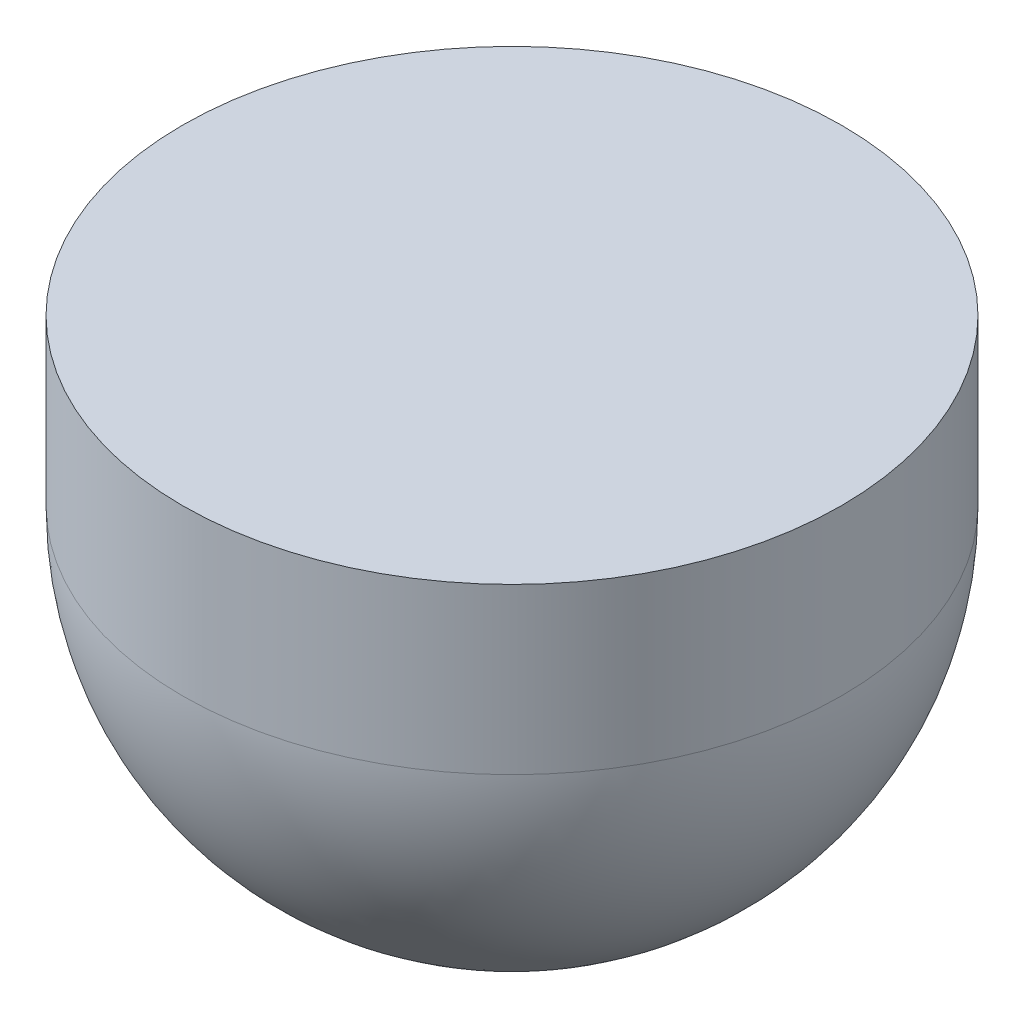
ISO-10303-21;
HEADER;
FILE_DESCRIPTION(('STEP AP214'),'2;1');
FILE_NAME('part.step','',(''),(''),'','','');
FILE_SCHEMA(('AUTOMOTIVE_DESIGN { 1 0 10303 214 1 1 1 1 }'));
ENDSEC;
DATA;
#1=APPLICATION_CONTEXT('core data for automotive mechanical design processes');
#2=APPLICATION_PROTOCOL_DEFINITION('international standard','automotive_design',2000,#1);
#3=PRODUCT_CONTEXT('',#1,'mechanical');
#4=PRODUCT('Part','Part','',(#3));
#5=PRODUCT_RELATED_PRODUCT_CATEGORY('part','',(#4));
#6=PRODUCT_DEFINITION_FORMATION('','',#4);
#7=PRODUCT_DEFINITION_CONTEXT('part definition',#1,'design');
#8=PRODUCT_DEFINITION('design','',#6,#7);
#9=PRODUCT_DEFINITION_SHAPE('','',#8);
#10=(LENGTH_UNIT() NAMED_UNIT(*) SI_UNIT(.MILLI.,.METRE.));
#11=(NAMED_UNIT(*) PLANE_ANGLE_UNIT() SI_UNIT($,.RADIAN.));
#12=(NAMED_UNIT(*) SI_UNIT($,.STERADIAN.) SOLID_ANGLE_UNIT());
#13=UNCERTAINTY_MEASURE_WITH_UNIT(LENGTH_MEASURE(1.E-05),#10,'distance_accuracy_value','');
#14=(GEOMETRIC_REPRESENTATION_CONTEXT(3) GLOBAL_UNCERTAINTY_ASSIGNED_CONTEXT((#13)) GLOBAL_UNIT_ASSIGNED_CONTEXT((#10,
#11,#12)) REPRESENTATION_CONTEXT('',''));
#15=CARTESIAN_POINT('',(0.,0.,0.));
#16=DIRECTION('',(0.,0.,1.));
#17=DIRECTION('',(1.,0.,0.));
#18=AXIS2_PLACEMENT_3D('',#15,#16,#17);
#19=CARTESIAN_POINT('',(-20.,0.,0.));
#20=DIRECTION('',(0.,1.,0.));
#21=DIRECTION('',(0.,0.,1.));
#22=AXIS2_PLACEMENT_3D('',#19,#20,#21);
#23=PLANE('',#22);
#24=CARTESIAN_POINT('',(0.,0.,0.));
#25=DIRECTION('',(0.,1.,0.));
#26=DIRECTION('',(0.,0.,1.));
#27=AXIS2_PLACEMENT_3D('',#24,#25,#26);
#28=CIRCLE('',#27,20.);
#29=CARTESIAN_POINT('',(0.,0.,20.));
#30=VERTEX_POINT('',#29);
#31=EDGE_CURVE('E10',#30,#30,#28,.T.);
#32=ORIENTED_EDGE('',*,*,#31,.T.);
#33=EDGE_LOOP('',(#32));
#34=FACE_BOUND('',#33,.T.);
#35=ADVANCED_FACE('F33',(#34),#23,.T.);
#36=CARTESIAN_POINT('',(0.,0.,0.));
#37=DIRECTION('',(0.,1.,0.));
#38=DIRECTION('',(0.,0.,1.));
#39=AXIS2_PLACEMENT_3D('',#36,#37,#38);
#40=CYLINDRICAL_SURFACE('',#39,20.);
#41=CARTESIAN_POINT('',(0.,-10.,0.));
#42=DIRECTION('',(0.,1.,0.));
#43=DIRECTION('',(0.,0.,1.));
#44=AXIS2_PLACEMENT_3D('',#41,#42,#43);
#45=CIRCLE('',#44,20.);
#46=CARTESIAN_POINT('',(0.,-10.,20.));
#47=VERTEX_POINT('',#46);
#48=EDGE_CURVE('E39',#47,#47,#45,.T.);
#49=ORIENTED_EDGE('',*,*,#48,.T.);
#50=EDGE_LOOP('',(#49));
#51=FACE_BOUND('',#50,.T.);
#52=ORIENTED_EDGE('',*,*,#31,.F.);
#53=EDGE_LOOP('',(#52));
#54=FACE_BOUND('',#53,.T.);
#55=ADVANCED_FACE('F45',(#51,#54),#40,.T.);
#56=CARTESIAN_POINT('',(0.,-10.,0.));
#57=DIRECTION('',(0.,1.,0.));
#58=DIRECTION('',(-1.,0.,0.));
#59=AXIS2_PLACEMENT_3D('',#56,#57,#58);
#60=SPHERICAL_SURFACE('',#59,20.);
#61=ORIENTED_EDGE('',*,*,#48,.F.);
#62=EDGE_LOOP('',(#61));
#63=FACE_BOUND('',#62,.T.);
#64=ADVANCED_FACE('F48',(#63),#60,.T.);
#65=CLOSED_SHELL('',(#35,#55,#64));
#66=MANIFOLD_SOLID_BREP('B2',#65);
#67=ADVANCED_BREP_SHAPE_REPRESENTATION('',(#18,#66),#14);
#68=SHAPE_DEFINITION_REPRESENTATION(#9,#67);
ENDSEC;
END-ISO-10303-21;
